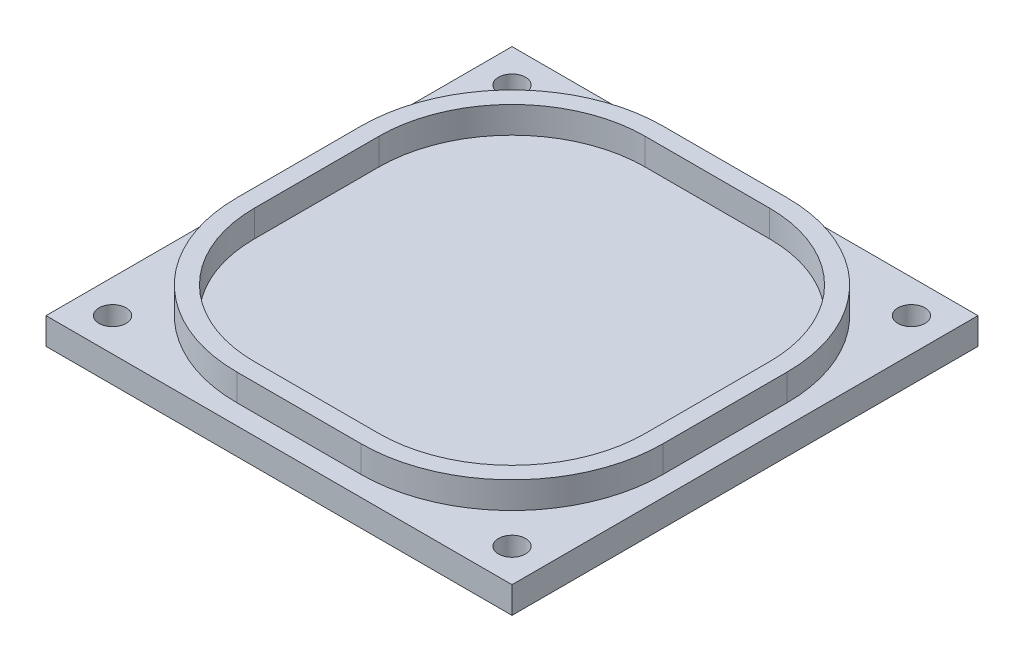
ISO-10303-21;
HEADER;
FILE_DESCRIPTION(('STEP AP214'),'2;1');
FILE_NAME('part.step','',(''),(''),'','','');
FILE_SCHEMA(('AUTOMOTIVE_DESIGN { 1 0 10303 214 1 1 1 1 }'));
ENDSEC;
DATA;
#1=APPLICATION_CONTEXT('core data for automotive mechanical design processes');
#2=APPLICATION_PROTOCOL_DEFINITION('international standard','automotive_design',2000,#1);
#3=PRODUCT_CONTEXT('',#1,'mechanical');
#4=PRODUCT('Part','Part','',(#3));
#5=PRODUCT_RELATED_PRODUCT_CATEGORY('part','',(#4));
#6=PRODUCT_DEFINITION_FORMATION('','',#4);
#7=PRODUCT_DEFINITION_CONTEXT('part definition',#1,'design');
#8=PRODUCT_DEFINITION('design','',#6,#7);
#9=PRODUCT_DEFINITION_SHAPE('','',#8);
#10=(LENGTH_UNIT() NAMED_UNIT(*) SI_UNIT(.MILLI.,.METRE.));
#11=(NAMED_UNIT(*) PLANE_ANGLE_UNIT() SI_UNIT($,.RADIAN.));
#12=(NAMED_UNIT(*) SI_UNIT($,.STERADIAN.) SOLID_ANGLE_UNIT());
#13=UNCERTAINTY_MEASURE_WITH_UNIT(LENGTH_MEASURE(1.E-05),#10,'distance_accuracy_value','');
#14=(GEOMETRIC_REPRESENTATION_CONTEXT(3) GLOBAL_UNCERTAINTY_ASSIGNED_CONTEXT((#13)) GLOBAL_UNIT_ASSIGNED_CONTEXT((#10,
#11,#12)) REPRESENTATION_CONTEXT('',''));
#15=CARTESIAN_POINT('',(0.,0.,0.));
#16=DIRECTION('',(0.,0.,1.));
#17=DIRECTION('',(1.,0.,0.));
#18=AXIS2_PLACEMENT_3D('',#15,#16,#17);
#19=CARTESIAN_POINT('',(0.,0.,0.));
#20=DIRECTION('',(0.,1.,0.));
#21=DIRECTION('',(0.,0.,1.));
#22=AXIS2_PLACEMENT_3D('',#19,#20,#21);
#23=PLANE('',#22);
#24=DIRECTION('',(0.,0.,1.));
#25=VECTOR('',#24,1.);
#26=CARTESIAN_POINT('',(287.147459621555,0.,287.147459621556));
#27=LINE('',#26,#25);
#28=CARTESIAN_POINT('',(287.147459621555,0.,287.147459621556));
#29=VERTEX_POINT('',#28);
#30=CARTESIAN_POINT('',(287.147459621555,0.,339.647459621556));
#31=VERTEX_POINT('',#30);
#32=EDGE_CURVE('E317',#29,#31,#27,.T.);
#33=ORIENTED_EDGE('',*,*,#32,.T.);
#34=DIRECTION('',(1.,0.,0.));
#35=VECTOR('',#34,1.);
#36=CARTESIAN_POINT('',(287.147459621555,0.,339.647459621556));
#37=LINE('',#36,#35);
#38=CARTESIAN_POINT('',(339.647459621555,0.,339.647459621556));
#39=VERTEX_POINT('',#38);
#40=EDGE_CURVE('E335',#31,#39,#37,.T.);
#41=ORIENTED_EDGE('',*,*,#40,.T.);
#42=DIRECTION('',(0.,0.,-1.));
#43=VECTOR('',#42,1.);
#44=CARTESIAN_POINT('',(339.647459621555,0.,339.647459621556));
#45=LINE('',#44,#43);
#46=CARTESIAN_POINT('',(339.647459621555,0.,287.147459621556));
#47=VERTEX_POINT('',#46);
#48=EDGE_CURVE('E338',#39,#47,#45,.T.);
#49=ORIENTED_EDGE('',*,*,#48,.T.);
#50=DIRECTION('',(-1.,0.,0.));
#51=VECTOR('',#50,1.);
#52=CARTESIAN_POINT('',(339.647459621555,0.,287.147459621556));
#53=LINE('',#52,#51);
#54=EDGE_CURVE('E324',#47,#29,#53,.T.);
#55=ORIENTED_EDGE('',*,*,#54,.T.);
#56=EDGE_LOOP('',(#33,#41,#49,#55));
#57=FACE_BOUND('',#56,.T.);
#58=CARTESIAN_POINT('',(335.897459621555,0.,290.897459621556));
#59=DIRECTION('',(0.,1.,0.));
#60=DIRECTION('',(0.,0.,1.));
#61=AXIS2_PLACEMENT_3D('',#58,#59,#60);
#62=CIRCLE('',#61,1.52499999999998);
#63=CARTESIAN_POINT('',(335.897459621555,0.,292.422459621556));
#64=VERTEX_POINT('',#63);
#65=EDGE_CURVE('E311',#64,#64,#62,.T.);
#66=ORIENTED_EDGE('',*,*,#65,.F.);
#67=EDGE_LOOP('',(#66));
#68=FACE_BOUND('',#67,.T.);
#69=CARTESIAN_POINT('',(335.897459621555,0.,335.897459621556));
#70=DIRECTION('',(0.,1.,0.));
#71=DIRECTION('',(0.,0.,1.));
#72=AXIS2_PLACEMENT_3D('',#69,#70,#71);
#73=CIRCLE('',#72,1.52499999999998);
#74=CARTESIAN_POINT('',(335.897459621555,0.,337.422459621556));
#75=VERTEX_POINT('',#74);
#76=EDGE_CURVE('E305',#75,#75,#73,.T.);
#77=ORIENTED_EDGE('',*,*,#76,.F.);
#78=EDGE_LOOP('',(#77));
#79=FACE_BOUND('',#78,.T.);
#80=CARTESIAN_POINT('',(290.897459621555,0.,290.897459621556));
#81=DIRECTION('',(0.,1.,0.));
#82=DIRECTION('',(0.,0.,1.));
#83=AXIS2_PLACEMENT_3D('',#80,#81,#82);
#84=CIRCLE('',#83,1.52499999999998);
#85=CARTESIAN_POINT('',(290.897459621555,0.,292.422459621556));
#86=VERTEX_POINT('',#85);
#87=EDGE_CURVE('E299',#86,#86,#84,.T.);
#88=ORIENTED_EDGE('',*,*,#87,.F.);
#89=EDGE_LOOP('',(#88));
#90=FACE_BOUND('',#89,.T.);
#91=CARTESIAN_POINT('',(290.897459621555,0.,335.897459621556));
#92=DIRECTION('',(0.,1.,0.));
#93=DIRECTION('',(0.,0.,1.));
#94=AXIS2_PLACEMENT_3D('',#91,#92,#93);
#95=CIRCLE('',#94,1.52499999999998);
#96=CARTESIAN_POINT('',(290.897459621555,0.,337.422459621556));
#97=VERTEX_POINT('',#96);
#98=EDGE_CURVE('E295',#97,#97,#95,.T.);
#99=ORIENTED_EDGE('',*,*,#98,.F.);
#100=EDGE_LOOP('',(#99));
#101=FACE_BOUND('',#100,.T.);
#102=DIRECTION('',(-1.,0.,0.));
#103=VECTOR('',#102,1.);
#104=CARTESIAN_POINT('',(320.397459621555,0.,289.397459621556));
#105=LINE('',#104,#103);
#106=CARTESIAN_POINT('',(320.397459621555,0.,289.397459621556));
#107=VERTEX_POINT('',#106);
#108=CARTESIAN_POINT('',(306.397459621555,0.,289.397459621556));
#109=VERTEX_POINT('',#108);
#110=EDGE_CURVE('E262',#107,#109,#105,.T.);
#111=ORIENTED_EDGE('',*,*,#110,.F.);
#112=CARTESIAN_POINT('',(320.397459621555,0.,306.397459621556));
#113=DIRECTION('',(0.,1.,0.));
#114=DIRECTION('',(0.,0.,1.));
#115=AXIS2_PLACEMENT_3D('',#112,#113,#114);
#116=CIRCLE('',#115,17.);
#117=CARTESIAN_POINT('',(337.397459621555,0.,306.397459621556));
#118=VERTEX_POINT('',#117);
#119=EDGE_CURVE('E190',#118,#107,#116,.T.);
#120=ORIENTED_EDGE('',*,*,#119,.F.);
#121=DIRECTION('',(0.,0.,-1.));
#122=VECTOR('',#121,1.);
#123=CARTESIAN_POINT('',(337.397459621555,0.,320.397459621556));
#124=LINE('',#123,#122);
#125=CARTESIAN_POINT('',(337.397459621555,0.,320.397459621556));
#126=VERTEX_POINT('',#125);
#127=EDGE_CURVE('E245',#126,#118,#124,.T.);
#128=ORIENTED_EDGE('',*,*,#127,.F.);
#129=CARTESIAN_POINT('',(320.397459621555,0.,320.397459621556));
#130=DIRECTION('',(0.,1.,0.));
#131=DIRECTION('',(0.,0.,1.));
#132=AXIS2_PLACEMENT_3D('',#129,#130,#131);
#133=CIRCLE('',#132,17.);
#134=CARTESIAN_POINT('',(320.397459621555,0.,337.397459621556));
#135=VERTEX_POINT('',#134);
#136=EDGE_CURVE('E272',#135,#126,#133,.T.);
#137=ORIENTED_EDGE('',*,*,#136,.F.);
#138=DIRECTION('',(1.,0.,0.));
#139=VECTOR('',#138,1.);
#140=CARTESIAN_POINT('',(306.397459621555,0.,337.397459621556));
#141=LINE('',#140,#139);
#142=CARTESIAN_POINT('',(306.397459621555,0.,337.397459621556));
#143=VERTEX_POINT('',#142);
#144=EDGE_CURVE('E270',#143,#135,#141,.T.);
#145=ORIENTED_EDGE('',*,*,#144,.F.);
#146=CARTESIAN_POINT('',(306.397459621555,0.,320.397459621556));
#147=DIRECTION('',(0.,1.,0.));
#148=DIRECTION('',(0.,0.,1.));
#149=AXIS2_PLACEMENT_3D('',#146,#147,#148);
#150=CIRCLE('',#149,17.);
#151=CARTESIAN_POINT('',(289.397459621555,0.,320.397459621556));
#152=VERTEX_POINT('',#151);
#153=EDGE_CURVE('E268',#152,#143,#150,.T.);
#154=ORIENTED_EDGE('',*,*,#153,.F.);
#155=DIRECTION('',(0.,0.,1.));
#156=VECTOR('',#155,1.);
#157=CARTESIAN_POINT('',(289.397459621555,0.,306.397459621556));
#158=LINE('',#157,#156);
#159=CARTESIAN_POINT('',(289.397459621555,0.,306.397459621556));
#160=VERTEX_POINT('',#159);
#161=EDGE_CURVE('E266',#160,#152,#158,.T.);
#162=ORIENTED_EDGE('',*,*,#161,.F.);
#163=CARTESIAN_POINT('',(306.397459621555,0.,306.397459621556));
#164=DIRECTION('',(0.,1.,0.));
#165=DIRECTION('',(0.,0.,-1.));
#166=AXIS2_PLACEMENT_3D('',#163,#164,#165);
#167=CIRCLE('',#166,17.);
#168=EDGE_CURVE('E264',#109,#160,#167,.T.);
#169=ORIENTED_EDGE('',*,*,#168,.F.);
#170=EDGE_LOOP('',(#111,#120,#128,#137,#145,#154,#162,#169));
#171=FACE_BOUND('',#170,.T.);
#172=ADVANCED_FACE('F33',(#57,#68,#79,#90,#101,#171),#23,.T.);
#173=CARTESIAN_POINT('',(287.147459621555,-3.,287.147459621556));
#174=DIRECTION('',(-1.,0.,0.));
#175=DIRECTION('',(0.,0.,1.));
#176=AXIS2_PLACEMENT_3D('',#173,#174,#175);
#177=PLANE('',#176);
#178=ORIENTED_EDGE('',*,*,#32,.F.);
#179=DIRECTION('',(0.,1.,0.));
#180=VECTOR('',#179,1.);
#181=CARTESIAN_POINT('',(287.147459621555,-3.,287.147459621556));
#182=LINE('',#181,#180);
#183=CARTESIAN_POINT('',(287.147459621555,-3.,287.147459621556));
#184=VERTEX_POINT('',#183);
#185=EDGE_CURVE('E11',#184,#29,#182,.T.);
#186=ORIENTED_EDGE('',*,*,#185,.F.);
#187=DIRECTION('',(0.,0.,1.));
#188=VECTOR('',#187,1.);
#189=CARTESIAN_POINT('',(287.147459621555,-3.,287.147459621556));
#190=LINE('',#189,#188);
#191=CARTESIAN_POINT('',(287.147459621555,-3.,339.647459621556));
#192=VERTEX_POINT('',#191);
#193=EDGE_CURVE('E320',#184,#192,#190,.T.);
#194=ORIENTED_EDGE('',*,*,#193,.T.);
#195=DIRECTION('',(0.,1.,0.));
#196=VECTOR('',#195,1.);
#197=CARTESIAN_POINT('',(287.147459621555,-3.,339.647459621556));
#198=LINE('',#197,#196);
#199=EDGE_CURVE('E37',#192,#31,#198,.T.);
#200=ORIENTED_EDGE('',*,*,#199,.T.);
#201=EDGE_LOOP('',(#178,#186,#194,#200));
#202=FACE_BOUND('',#201,.T.);
#203=ADVANCED_FACE('F35',(#202),#177,.T.);
#204=CARTESIAN_POINT('',(339.647459621555,-3.,287.147459621556));
#205=DIRECTION('',(0.,0.,-1.));
#206=DIRECTION('',(-1.,0.,0.));
#207=AXIS2_PLACEMENT_3D('',#204,#205,#206);
#208=PLANE('',#207);
#209=ORIENTED_EDGE('',*,*,#54,.F.);
#210=DIRECTION('',(0.,1.,0.));
#211=VECTOR('',#210,1.);
#212=CARTESIAN_POINT('',(339.647459621555,-3.,287.147459621556));
#213=LINE('',#212,#211);
#214=CARTESIAN_POINT('',(339.647459621555,-3.,287.147459621556));
#215=VERTEX_POINT('',#214);
#216=EDGE_CURVE('E42',#215,#47,#213,.T.);
#217=ORIENTED_EDGE('',*,*,#216,.F.);
#218=DIRECTION('',(-1.,0.,0.));
#219=VECTOR('',#218,1.);
#220=CARTESIAN_POINT('',(339.647459621555,-3.,287.147459621556));
#221=LINE('',#220,#219);
#222=EDGE_CURVE('E330',#215,#184,#221,.T.);
#223=ORIENTED_EDGE('',*,*,#222,.T.);
#224=ORIENTED_EDGE('',*,*,#185,.T.);
#225=EDGE_LOOP('',(#209,#217,#223,#224));
#226=FACE_BOUND('',#225,.T.);
#227=ADVANCED_FACE('F356',(#226),#208,.T.);
#228=CARTESIAN_POINT('',(339.647459621555,-3.,339.647459621556));
#229=DIRECTION('',(1.,0.,0.));
#230=DIRECTION('',(0.,0.,-1.));
#231=AXIS2_PLACEMENT_3D('',#228,#229,#230);
#232=PLANE('',#231);
#233=ORIENTED_EDGE('',*,*,#48,.F.);
#234=DIRECTION('',(0.,1.,0.));
#235=VECTOR('',#234,1.);
#236=CARTESIAN_POINT('',(339.647459621555,-3.,339.647459621556));
#237=LINE('',#236,#235);
#238=CARTESIAN_POINT('',(339.647459621555,-3.,339.647459621556));
#239=VERTEX_POINT('',#238);
#240=EDGE_CURVE('E343',#239,#39,#237,.T.);
#241=ORIENTED_EDGE('',*,*,#240,.F.);
#242=DIRECTION('',(0.,0.,-1.));
#243=VECTOR('',#242,1.);
#244=CARTESIAN_POINT('',(339.647459621555,-3.,339.647459621556));
#245=LINE('',#244,#243);
#246=EDGE_CURVE('E327',#239,#215,#245,.T.);
#247=ORIENTED_EDGE('',*,*,#246,.T.);
#248=ORIENTED_EDGE('',*,*,#216,.T.);
#249=EDGE_LOOP('',(#233,#241,#247,#248));
#250=FACE_BOUND('',#249,.T.);
#251=ADVANCED_FACE('F362',(#250),#232,.T.);
#252=CARTESIAN_POINT('',(287.147459621555,-3.,339.647459621556));
#253=DIRECTION('',(0.,0.,1.));
#254=DIRECTION('',(1.,0.,0.));
#255=AXIS2_PLACEMENT_3D('',#252,#253,#254);
#256=PLANE('',#255);
#257=ORIENTED_EDGE('',*,*,#40,.F.);
#258=ORIENTED_EDGE('',*,*,#199,.F.);
#259=DIRECTION('',(1.,0.,0.));
#260=VECTOR('',#259,1.);
#261=CARTESIAN_POINT('',(287.147459621555,-3.,339.647459621556));
#262=LINE('',#261,#260);
#263=EDGE_CURVE('E323',#192,#239,#262,.T.);
#264=ORIENTED_EDGE('',*,*,#263,.T.);
#265=ORIENTED_EDGE('',*,*,#240,.T.);
#266=EDGE_LOOP('',(#257,#258,#264,#265));
#267=FACE_BOUND('',#266,.T.);
#268=ADVANCED_FACE('F351',(#267),#256,.T.);
#269=CARTESIAN_POINT('',(0.,-3.,0.));
#270=DIRECTION('',(0.,1.,0.));
#271=DIRECTION('',(0.,0.,1.));
#272=AXIS2_PLACEMENT_3D('',#269,#270,#271);
#273=PLANE('',#272);
#274=CARTESIAN_POINT('',(290.897459621555,-3.,335.897459621556));
#275=DIRECTION('',(0.,1.,0.));
#276=DIRECTION('',(0.,0.,1.));
#277=AXIS2_PLACEMENT_3D('',#274,#275,#276);
#278=CIRCLE('',#277,1.52499999999998);
#279=CARTESIAN_POINT('',(290.897459621555,-3.,337.422459621556));
#280=VERTEX_POINT('',#279);
#281=EDGE_CURVE('E296',#280,#280,#278,.T.);
#282=ORIENTED_EDGE('',*,*,#281,.T.);
#283=EDGE_LOOP('',(#282));
#284=FACE_BOUND('',#283,.T.);
#285=CARTESIAN_POINT('',(290.897459621555,-3.,290.897459621556));
#286=DIRECTION('',(0.,1.,0.));
#287=DIRECTION('',(0.,0.,1.));
#288=AXIS2_PLACEMENT_3D('',#285,#286,#287);
#289=CIRCLE('',#288,1.52499999999998);
#290=CARTESIAN_POINT('',(290.897459621555,-3.,292.422459621556));
#291=VERTEX_POINT('',#290);
#292=EDGE_CURVE('E302',#291,#291,#289,.T.);
#293=ORIENTED_EDGE('',*,*,#292,.T.);
#294=EDGE_LOOP('',(#293));
#295=FACE_BOUND('',#294,.T.);
#296=CARTESIAN_POINT('',(335.897459621555,-3.,335.897459621556));
#297=DIRECTION('',(0.,1.,0.));
#298=DIRECTION('',(0.,0.,1.));
#299=AXIS2_PLACEMENT_3D('',#296,#297,#298);
#300=CIRCLE('',#299,1.52499999999998);
#301=CARTESIAN_POINT('',(335.897459621555,-3.,337.422459621556));
#302=VERTEX_POINT('',#301);
#303=EDGE_CURVE('E308',#302,#302,#300,.T.);
#304=ORIENTED_EDGE('',*,*,#303,.T.);
#305=EDGE_LOOP('',(#304));
#306=FACE_BOUND('',#305,.T.);
#307=CARTESIAN_POINT('',(335.897459621555,-3.,290.897459621556));
#308=DIRECTION('',(0.,1.,0.));
#309=DIRECTION('',(0.,0.,1.));
#310=AXIS2_PLACEMENT_3D('',#307,#308,#309);
#311=CIRCLE('',#310,1.52499999999998);
#312=CARTESIAN_POINT('',(335.897459621555,-3.,292.422459621556));
#313=VERTEX_POINT('',#312);
#314=EDGE_CURVE('E314',#313,#313,#311,.T.);
#315=ORIENTED_EDGE('',*,*,#314,.T.);
#316=EDGE_LOOP('',(#315));
#317=FACE_BOUND('',#316,.T.);
#318=ORIENTED_EDGE('',*,*,#193,.F.);
#319=ORIENTED_EDGE('',*,*,#222,.F.);
#320=ORIENTED_EDGE('',*,*,#246,.F.);
#321=ORIENTED_EDGE('',*,*,#263,.F.);
#322=EDGE_LOOP('',(#318,#319,#320,#321));
#323=FACE_BOUND('',#322,.T.);
#324=ADVANCED_FACE('F359',(#284,#295,#306,#317,#323),#273,.F.);
#325=CARTESIAN_POINT('',(335.897459621555,-3.,290.897459621556));
#326=DIRECTION('',(0.,1.,0.));
#327=DIRECTION('',(0.,0.,1.));
#328=AXIS2_PLACEMENT_3D('',#325,#326,#327);
#329=CYLINDRICAL_SURFACE('',#328,1.52499999999998);
#330=ORIENTED_EDGE('',*,*,#314,.F.);
#331=EDGE_LOOP('',(#330));
#332=FACE_BOUND('',#331,.T.);
#333=ORIENTED_EDGE('',*,*,#65,.T.);
#334=EDGE_LOOP('',(#333));
#335=FACE_BOUND('',#334,.T.);
#336=ADVANCED_FACE('F457',(#332,#335),#329,.F.);
#337=CARTESIAN_POINT('',(335.897459621555,-3.,335.897459621556));
#338=DIRECTION('',(0.,1.,0.));
#339=DIRECTION('',(0.,0.,1.));
#340=AXIS2_PLACEMENT_3D('',#337,#338,#339);
#341=CYLINDRICAL_SURFACE('',#340,1.52499999999998);
#342=ORIENTED_EDGE('',*,*,#303,.F.);
#343=EDGE_LOOP('',(#342));
#344=FACE_BOUND('',#343,.T.);
#345=ORIENTED_EDGE('',*,*,#76,.T.);
#346=EDGE_LOOP('',(#345));
#347=FACE_BOUND('',#346,.T.);
#348=ADVANCED_FACE('F453',(#344,#347),#341,.F.);
#349=CARTESIAN_POINT('',(290.897459621555,-3.,290.897459621556));
#350=DIRECTION('',(0.,1.,0.));
#351=DIRECTION('',(0.,0.,1.));
#352=AXIS2_PLACEMENT_3D('',#349,#350,#351);
#353=CYLINDRICAL_SURFACE('',#352,1.52499999999998);
#354=ORIENTED_EDGE('',*,*,#292,.F.);
#355=EDGE_LOOP('',(#354));
#356=FACE_BOUND('',#355,.T.);
#357=ORIENTED_EDGE('',*,*,#87,.T.);
#358=EDGE_LOOP('',(#357));
#359=FACE_BOUND('',#358,.T.);
#360=ADVANCED_FACE('F449',(#356,#359),#353,.F.);
#361=CARTESIAN_POINT('',(290.897459621555,-3.,335.897459621556));
#362=DIRECTION('',(0.,1.,0.));
#363=DIRECTION('',(0.,0.,1.));
#364=AXIS2_PLACEMENT_3D('',#361,#362,#363);
#365=CYLINDRICAL_SURFACE('',#364,1.52499999999998);
#366=ORIENTED_EDGE('',*,*,#281,.F.);
#367=EDGE_LOOP('',(#366));
#368=FACE_BOUND('',#367,.T.);
#369=ORIENTED_EDGE('',*,*,#98,.T.);
#370=EDGE_LOOP('',(#369));
#371=FACE_BOUND('',#370,.T.);
#372=ADVANCED_FACE('F416',(#368,#371),#365,.F.);
#373=CARTESIAN_POINT('',(320.397459621555,3.,306.397459621556));
#374=DIRECTION('',(0.,1.,0.));
#375=DIRECTION('',(0.,0.,1.));
#376=AXIS2_PLACEMENT_3D('',#373,#374,#375);
#377=PLANE('',#376);
#378=CARTESIAN_POINT('',(320.397459621555,3.,306.397459621556));
#379=DIRECTION('',(0.,1.,0.));
#380=DIRECTION('',(0.,0.,1.));
#381=AXIS2_PLACEMENT_3D('',#378,#379,#380);
#382=CIRCLE('',#381,17.);
#383=CARTESIAN_POINT('',(337.397459621555,3.,306.397459621556));
#384=VERTEX_POINT('',#383);
#385=CARTESIAN_POINT('',(320.397459621555,3.,289.397459621556));
#386=VERTEX_POINT('',#385);
#387=EDGE_CURVE('E241',#384,#386,#382,.T.);
#388=ORIENTED_EDGE('',*,*,#387,.T.);
#389=DIRECTION('',(-1.,0.,0.));
#390=VECTOR('',#389,1.);
#391=CARTESIAN_POINT('',(320.397459621555,3.,289.397459621556));
#392=LINE('',#391,#390);
#393=CARTESIAN_POINT('',(306.397459621555,3.,289.397459621556));
#394=VERTEX_POINT('',#393);
#395=EDGE_CURVE('E244',#386,#394,#392,.T.);
#396=ORIENTED_EDGE('',*,*,#395,.T.);
#397=CARTESIAN_POINT('',(306.397459621555,3.,306.397459621556));
#398=DIRECTION('',(0.,1.,0.));
#399=DIRECTION('',(0.,0.,-1.));
#400=AXIS2_PLACEMENT_3D('',#397,#398,#399);
#401=CIRCLE('',#400,17.);
#402=CARTESIAN_POINT('',(289.397459621555,3.,306.397459621556));
#403=VERTEX_POINT('',#402);
#404=EDGE_CURVE('E247',#394,#403,#401,.T.);
#405=ORIENTED_EDGE('',*,*,#404,.T.);
#406=DIRECTION('',(0.,0.,1.));
#407=VECTOR('',#406,1.);
#408=CARTESIAN_POINT('',(289.397459621555,3.,306.397459621556));
#409=LINE('',#408,#407);
#410=CARTESIAN_POINT('',(289.397459621555,3.,320.397459621556));
#411=VERTEX_POINT('',#410);
#412=EDGE_CURVE('E249',#403,#411,#409,.T.);
#413=ORIENTED_EDGE('',*,*,#412,.T.);
#414=CARTESIAN_POINT('',(306.397459621555,3.,320.397459621556));
#415=DIRECTION('',(0.,1.,0.));
#416=DIRECTION('',(0.,0.,1.));
#417=AXIS2_PLACEMENT_3D('',#414,#415,#416);
#418=CIRCLE('',#417,17.);
#419=CARTESIAN_POINT('',(306.397459621555,3.,337.397459621556));
#420=VERTEX_POINT('',#419);
#421=EDGE_CURVE('E251',#411,#420,#418,.T.);
#422=ORIENTED_EDGE('',*,*,#421,.T.);
#423=DIRECTION('',(1.,0.,0.));
#424=VECTOR('',#423,1.);
#425=CARTESIAN_POINT('',(306.397459621555,3.,337.397459621556));
#426=LINE('',#425,#424);
#427=CARTESIAN_POINT('',(320.397459621555,3.,337.397459621556));
#428=VERTEX_POINT('',#427);
#429=EDGE_CURVE('E253',#420,#428,#426,.T.);
#430=ORIENTED_EDGE('',*,*,#429,.T.);
#431=CARTESIAN_POINT('',(320.397459621555,3.,320.397459621556));
#432=DIRECTION('',(0.,1.,0.));
#433=DIRECTION('',(0.,0.,1.));
#434=AXIS2_PLACEMENT_3D('',#431,#432,#433);
#435=CIRCLE('',#434,17.);
#436=CARTESIAN_POINT('',(337.397459621555,3.,320.397459621556));
#437=VERTEX_POINT('',#436);
#438=EDGE_CURVE('E255',#428,#437,#435,.T.);
#439=ORIENTED_EDGE('',*,*,#438,.T.);
#440=DIRECTION('',(0.,0.,-1.));
#441=VECTOR('',#440,1.);
#442=CARTESIAN_POINT('',(337.397459621555,3.,320.397459621556));
#443=LINE('',#442,#441);
#444=EDGE_CURVE('E257',#437,#384,#443,.T.);
#445=ORIENTED_EDGE('',*,*,#444,.T.);
#446=EDGE_LOOP('',(#388,#396,#405,#413,#422,#430,#439,#445));
#447=FACE_BOUND('',#446,.T.);
#448=DIRECTION('',(1.,0.,0.));
#449=VECTOR('',#448,1.);
#450=CARTESIAN_POINT('',(306.397459621555,3.,335.397459621556));
#451=LINE('',#450,#449);
#452=CARTESIAN_POINT('',(306.397459621555,3.,335.397459621556));
#453=VERTEX_POINT('',#452);
#454=CARTESIAN_POINT('',(320.397459621555,3.,335.397459621556));
#455=VERTEX_POINT('',#454);
#456=EDGE_CURVE('E182',#453,#455,#451,.T.);
#457=ORIENTED_EDGE('',*,*,#456,.F.);
#458=CARTESIAN_POINT('',(306.397459621555,3.,320.397459621556));
#459=DIRECTION('',(0.,1.,0.));
#460=DIRECTION('',(0.,0.,1.));
#461=AXIS2_PLACEMENT_3D('',#458,#459,#460);
#462=CIRCLE('',#461,15.);
#463=CARTESIAN_POINT('',(291.397459621555,3.,320.397459621556));
#464=VERTEX_POINT('',#463);
#465=EDGE_CURVE('E173',#464,#453,#462,.T.);
#466=ORIENTED_EDGE('',*,*,#465,.F.);
#467=DIRECTION('',(0.,0.,1.));
#468=VECTOR('',#467,1.);
#469=CARTESIAN_POINT('',(291.397459621555,3.,306.397459621556));
#470=LINE('',#469,#468);
#471=CARTESIAN_POINT('',(291.397459621555,3.,306.397459621556));
#472=VERTEX_POINT('',#471);
#473=EDGE_CURVE('E209',#472,#464,#470,.T.);
#474=ORIENTED_EDGE('',*,*,#473,.F.);
#475=CARTESIAN_POINT('',(306.397459621555,3.,306.397459621556));
#476=DIRECTION('',(0.,1.,0.));
#477=DIRECTION('',(0.,0.,-1.));
#478=AXIS2_PLACEMENT_3D('',#475,#476,#477);
#479=CIRCLE('',#478,15.);
#480=CARTESIAN_POINT('',(306.397459621555,3.,291.397459621556));
#481=VERTEX_POINT('',#480);
#482=EDGE_CURVE('E206',#481,#472,#479,.T.);
#483=ORIENTED_EDGE('',*,*,#482,.F.);
#484=DIRECTION('',(-1.,0.,0.));
#485=VECTOR('',#484,1.);
#486=CARTESIAN_POINT('',(320.397459621555,3.,291.397459621556));
#487=LINE('',#486,#485);
#488=CARTESIAN_POINT('',(320.397459621555,3.,291.397459621556));
#489=VERTEX_POINT('',#488);
#490=EDGE_CURVE('E204',#489,#481,#487,.T.);
#491=ORIENTED_EDGE('',*,*,#490,.F.);
#492=CARTESIAN_POINT('',(320.397459621555,3.,306.397459621556));
#493=DIRECTION('',(0.,1.,0.));
#494=DIRECTION('',(0.,0.,1.));
#495=AXIS2_PLACEMENT_3D('',#492,#493,#494);
#496=CIRCLE('',#495,15.);
#497=CARTESIAN_POINT('',(335.397459621555,3.,306.397459621556));
#498=VERTEX_POINT('',#497);
#499=EDGE_CURVE('E202',#498,#489,#496,.T.);
#500=ORIENTED_EDGE('',*,*,#499,.F.);
#501=DIRECTION('',(0.,0.,-1.));
#502=VECTOR('',#501,1.);
#503=CARTESIAN_POINT('',(335.397459621555,3.,320.397459621556));
#504=LINE('',#503,#502);
#505=CARTESIAN_POINT('',(335.397459621555,3.,320.397459621556));
#506=VERTEX_POINT('',#505);
#507=EDGE_CURVE('E198',#506,#498,#504,.T.);
#508=ORIENTED_EDGE('',*,*,#507,.F.);
#509=CARTESIAN_POINT('',(320.397459621555,3.,320.397459621556));
#510=DIRECTION('',(0.,1.,0.));
#511=DIRECTION('',(0.,0.,1.));
#512=AXIS2_PLACEMENT_3D('',#509,#510,#511);
#513=CIRCLE('',#512,15.);
#514=EDGE_CURVE('E196',#455,#506,#513,.T.);
#515=ORIENTED_EDGE('',*,*,#514,.F.);
#516=EDGE_LOOP('',(#457,#466,#474,#483,#491,#500,#508,#515));
#517=FACE_BOUND('',#516,.T.);
#518=ADVANCED_FACE('F194',(#447,#517),#377,.T.);
#519=CARTESIAN_POINT('',(320.397459621555,3.,306.397459621556));
#520=DIRECTION('',(0.,-1.,0.));
#521=DIRECTION('',(0.,0.,-1.));
#522=AXIS2_PLACEMENT_3D('',#519,#520,#521);
#523=CYLINDRICAL_SURFACE('',#522,17.);
#524=ORIENTED_EDGE('',*,*,#119,.T.);
#525=DIRECTION('',(0.,-1.,0.));
#526=VECTOR('',#525,1.);
#527=CARTESIAN_POINT('',(320.397459621555,3.,289.397459621556));
#528=LINE('',#527,#526);
#529=EDGE_CURVE('E293',#386,#107,#528,.T.);
#530=ORIENTED_EDGE('',*,*,#529,.F.);
#531=ORIENTED_EDGE('',*,*,#387,.F.);
#532=DIRECTION('',(0.,-1.,0.));
#533=VECTOR('',#532,1.);
#534=CARTESIAN_POINT('',(337.397459621555,3.,306.397459621556));
#535=LINE('',#534,#533);
#536=EDGE_CURVE('E259',#384,#118,#535,.T.);
#537=ORIENTED_EDGE('',*,*,#536,.T.);
#538=EDGE_LOOP('',(#524,#530,#531,#537));
#539=FACE_BOUND('',#538,.T.);
#540=ADVANCED_FACE('F415',(#539),#523,.T.);
#541=CARTESIAN_POINT('',(320.397459621555,3.,289.397459621556));
#542=DIRECTION('',(0.,0.,1.));
#543=DIRECTION('',(1.,0.,0.));
#544=AXIS2_PLACEMENT_3D('',#541,#542,#543);
#545=PLANE('',#544);
#546=ORIENTED_EDGE('',*,*,#110,.T.);
#547=DIRECTION('',(0.,-1.,0.));
#548=VECTOR('',#547,1.);
#549=CARTESIAN_POINT('',(306.397459621555,3.,289.397459621556));
#550=LINE('',#549,#548);
#551=EDGE_CURVE('E290',#394,#109,#550,.T.);
#552=ORIENTED_EDGE('',*,*,#551,.F.);
#553=ORIENTED_EDGE('',*,*,#395,.F.);
#554=ORIENTED_EDGE('',*,*,#529,.T.);
#555=EDGE_LOOP('',(#546,#552,#553,#554));
#556=FACE_BOUND('',#555,.T.);
#557=ADVANCED_FACE('F439',(#556),#545,.F.);
#558=CARTESIAN_POINT('',(306.397459621555,3.,306.397459621556));
#559=DIRECTION('',(0.,-1.,0.));
#560=DIRECTION('',(0.,0.,-1.));
#561=AXIS2_PLACEMENT_3D('',#558,#559,#560);
#562=CYLINDRICAL_SURFACE('',#561,17.);
#563=ORIENTED_EDGE('',*,*,#168,.T.);
#564=DIRECTION('',(0.,-1.,0.));
#565=VECTOR('',#564,1.);
#566=CARTESIAN_POINT('',(289.397459621555,3.,306.397459621556));
#567=LINE('',#566,#565);
#568=EDGE_CURVE('E287',#403,#160,#567,.T.);
#569=ORIENTED_EDGE('',*,*,#568,.F.);
#570=ORIENTED_EDGE('',*,*,#404,.F.);
#571=ORIENTED_EDGE('',*,*,#551,.T.);
#572=EDGE_LOOP('',(#563,#569,#570,#571));
#573=FACE_BOUND('',#572,.T.);
#574=ADVANCED_FACE('F435',(#573),#562,.T.);
#575=CARTESIAN_POINT('',(289.397459621555,3.,306.397459621556));
#576=DIRECTION('',(1.,0.,0.));
#577=DIRECTION('',(0.,0.,-1.));
#578=AXIS2_PLACEMENT_3D('',#575,#576,#577);
#579=PLANE('',#578);
#580=ORIENTED_EDGE('',*,*,#161,.T.);
#581=DIRECTION('',(0.,-1.,0.));
#582=VECTOR('',#581,1.);
#583=CARTESIAN_POINT('',(289.397459621555,3.,320.397459621556));
#584=LINE('',#583,#582);
#585=EDGE_CURVE('E284',#411,#152,#584,.T.);
#586=ORIENTED_EDGE('',*,*,#585,.F.);
#587=ORIENTED_EDGE('',*,*,#412,.F.);
#588=ORIENTED_EDGE('',*,*,#568,.T.);
#589=EDGE_LOOP('',(#580,#586,#587,#588));
#590=FACE_BOUND('',#589,.T.);
#591=ADVANCED_FACE('F431',(#590),#579,.F.);
#592=CARTESIAN_POINT('',(306.397459621555,3.,320.397459621556));
#593=DIRECTION('',(0.,-1.,0.));
#594=DIRECTION('',(0.,0.,-1.));
#595=AXIS2_PLACEMENT_3D('',#592,#593,#594);
#596=CYLINDRICAL_SURFACE('',#595,17.);
#597=ORIENTED_EDGE('',*,*,#153,.T.);
#598=DIRECTION('',(0.,-1.,0.));
#599=VECTOR('',#598,1.);
#600=CARTESIAN_POINT('',(306.397459621555,3.,337.397459621556));
#601=LINE('',#600,#599);
#602=EDGE_CURVE('E281',#420,#143,#601,.T.);
#603=ORIENTED_EDGE('',*,*,#602,.F.);
#604=ORIENTED_EDGE('',*,*,#421,.F.);
#605=ORIENTED_EDGE('',*,*,#585,.T.);
#606=EDGE_LOOP('',(#597,#603,#604,#605));
#607=FACE_BOUND('',#606,.T.);
#608=ADVANCED_FACE('F427',(#607),#596,.T.);
#609=CARTESIAN_POINT('',(306.397459621555,3.,337.397459621556));
#610=DIRECTION('',(0.,0.,-1.));
#611=DIRECTION('',(-1.,0.,0.));
#612=AXIS2_PLACEMENT_3D('',#609,#610,#611);
#613=PLANE('',#612);
#614=ORIENTED_EDGE('',*,*,#144,.T.);
#615=DIRECTION('',(0.,-1.,0.));
#616=VECTOR('',#615,1.);
#617=CARTESIAN_POINT('',(320.397459621555,3.,337.397459621556));
#618=LINE('',#617,#616);
#619=EDGE_CURVE('E278',#428,#135,#618,.T.);
#620=ORIENTED_EDGE('',*,*,#619,.F.);
#621=ORIENTED_EDGE('',*,*,#429,.F.);
#622=ORIENTED_EDGE('',*,*,#602,.T.);
#623=EDGE_LOOP('',(#614,#620,#621,#622));
#624=FACE_BOUND('',#623,.T.);
#625=ADVANCED_FACE('F423',(#624),#613,.F.);
#626=CARTESIAN_POINT('',(320.397459621555,3.,320.397459621556));
#627=DIRECTION('',(0.,-1.,0.));
#628=DIRECTION('',(0.,0.,-1.));
#629=AXIS2_PLACEMENT_3D('',#626,#627,#628);
#630=CYLINDRICAL_SURFACE('',#629,17.);
#631=ORIENTED_EDGE('',*,*,#136,.T.);
#632=DIRECTION('',(0.,-1.,0.));
#633=VECTOR('',#632,1.);
#634=CARTESIAN_POINT('',(337.397459621555,3.,320.397459621556));
#635=LINE('',#634,#633);
#636=EDGE_CURVE('E50',#437,#126,#635,.T.);
#637=ORIENTED_EDGE('',*,*,#636,.F.);
#638=ORIENTED_EDGE('',*,*,#438,.F.);
#639=ORIENTED_EDGE('',*,*,#619,.T.);
#640=EDGE_LOOP('',(#631,#637,#638,#639));
#641=FACE_BOUND('',#640,.T.);
#642=ADVANCED_FACE('F420',(#641),#630,.T.);
#643=CARTESIAN_POINT('',(337.397459621555,3.,320.397459621556));
#644=DIRECTION('',(-1.,0.,0.));
#645=DIRECTION('',(0.,0.,1.));
#646=AXIS2_PLACEMENT_3D('',#643,#644,#645);
#647=PLANE('',#646);
#648=ORIENTED_EDGE('',*,*,#127,.T.);
#649=ORIENTED_EDGE('',*,*,#536,.F.);
#650=ORIENTED_EDGE('',*,*,#444,.F.);
#651=ORIENTED_EDGE('',*,*,#636,.T.);
#652=EDGE_LOOP('',(#648,#649,#650,#651));
#653=FACE_BOUND('',#652,.T.);
#654=ADVANCED_FACE('F412',(#653),#647,.F.);
#655=CARTESIAN_POINT('',(306.397459621555,3.,320.397459621556));
#656=DIRECTION('',(0.,-1.,0.));
#657=DIRECTION('',(0.,0.,-1.));
#658=AXIS2_PLACEMENT_3D('',#655,#656,#657);
#659=CYLINDRICAL_SURFACE('',#658,15.);
#660=CARTESIAN_POINT('',(306.397459621555,0.,320.397459621556));
#661=DIRECTION('',(0.,1.,0.));
#662=DIRECTION('',(0.,0.,1.));
#663=AXIS2_PLACEMENT_3D('',#660,#661,#662);
#664=CIRCLE('',#663,15.);
#665=CARTESIAN_POINT('',(291.397459621555,0.,320.397459621556));
#666=VERTEX_POINT('',#665);
#667=CARTESIAN_POINT('',(306.397459621555,0.,335.397459621556));
#668=VERTEX_POINT('',#667);
#669=EDGE_CURVE('E58',#666,#668,#664,.T.);
#670=ORIENTED_EDGE('',*,*,#669,.F.);
#671=DIRECTION('',(0.,-1.,0.));
#672=VECTOR('',#671,1.);
#673=CARTESIAN_POINT('',(291.397459621555,3.,320.397459621556));
#674=LINE('',#673,#672);
#675=EDGE_CURVE('E178',#464,#666,#674,.T.);
#676=ORIENTED_EDGE('',*,*,#675,.F.);
#677=ORIENTED_EDGE('',*,*,#465,.T.);
#678=DIRECTION('',(0.,-1.,0.));
#679=VECTOR('',#678,1.);
#680=CARTESIAN_POINT('',(306.397459621555,3.,335.397459621556));
#681=LINE('',#680,#679);
#682=EDGE_CURVE('E176',#453,#668,#681,.T.);
#683=ORIENTED_EDGE('',*,*,#682,.T.);
#684=EDGE_LOOP('',(#670,#676,#677,#683));
#685=FACE_BOUND('',#684,.T.);
#686=ADVANCED_FACE('F175',(#685),#659,.F.);
#687=CARTESIAN_POINT('',(306.397459621555,3.,335.397459621556));
#688=DIRECTION('',(0.,0.,-1.));
#689=DIRECTION('',(-1.,0.,0.));
#690=AXIS2_PLACEMENT_3D('',#687,#688,#689);
#691=PLANE('',#690);
#692=DIRECTION('',(1.,0.,0.));
#693=VECTOR('',#692,1.);
#694=CARTESIAN_POINT('',(306.397459621555,0.,335.397459621556));
#695=LINE('',#694,#693);
#696=CARTESIAN_POINT('',(320.397459621555,0.,335.397459621556));
#697=VERTEX_POINT('',#696);
#698=EDGE_CURVE('E189',#668,#697,#695,.T.);
#699=ORIENTED_EDGE('',*,*,#698,.F.);
#700=ORIENTED_EDGE('',*,*,#682,.F.);
#701=ORIENTED_EDGE('',*,*,#456,.T.);
#702=DIRECTION('',(0.,-1.,0.));
#703=VECTOR('',#702,1.);
#704=CARTESIAN_POINT('',(320.397459621555,3.,335.397459621556));
#705=LINE('',#704,#703);
#706=EDGE_CURVE('E191',#455,#697,#705,.T.);
#707=ORIENTED_EDGE('',*,*,#706,.T.);
#708=EDGE_LOOP('',(#699,#700,#701,#707));
#709=FACE_BOUND('',#708,.T.);
#710=ADVANCED_FACE('F186',(#709),#691,.T.);
#711=CARTESIAN_POINT('',(320.397459621555,3.,320.397459621556));
#712=DIRECTION('',(0.,-1.,0.));
#713=DIRECTION('',(0.,0.,-1.));
#714=AXIS2_PLACEMENT_3D('',#711,#712,#713);
#715=CYLINDRICAL_SURFACE('',#714,15.);
#716=CARTESIAN_POINT('',(320.397459621555,0.,320.397459621556));
#717=DIRECTION('',(0.,1.,0.));
#718=DIRECTION('',(0.,0.,1.));
#719=AXIS2_PLACEMENT_3D('',#716,#717,#718);
#720=CIRCLE('',#719,15.);
#721=CARTESIAN_POINT('',(335.397459621555,0.,320.397459621556));
#722=VERTEX_POINT('',#721);
#723=EDGE_CURVE('E213',#697,#722,#720,.T.);
#724=ORIENTED_EDGE('',*,*,#723,.F.);
#725=ORIENTED_EDGE('',*,*,#706,.F.);
#726=ORIENTED_EDGE('',*,*,#514,.T.);
#727=DIRECTION('',(0.,-1.,0.));
#728=VECTOR('',#727,1.);
#729=CARTESIAN_POINT('',(335.397459621555,3.,320.397459621556));
#730=LINE('',#729,#728);
#731=EDGE_CURVE('E237',#506,#722,#730,.T.);
#732=ORIENTED_EDGE('',*,*,#731,.T.);
#733=EDGE_LOOP('',(#724,#725,#726,#732));
#734=FACE_BOUND('',#733,.T.);
#735=ADVANCED_FACE('F403',(#734),#715,.F.);
#736=CARTESIAN_POINT('',(335.397459621555,3.,320.397459621556));
#737=DIRECTION('',(-1.,0.,0.));
#738=DIRECTION('',(0.,0.,1.));
#739=AXIS2_PLACEMENT_3D('',#736,#737,#738);
#740=PLANE('',#739);
#741=DIRECTION('',(0.,0.,-1.));
#742=VECTOR('',#741,1.);
#743=CARTESIAN_POINT('',(335.397459621555,0.,320.397459621556));
#744=LINE('',#743,#742);
#745=CARTESIAN_POINT('',(335.397459621555,0.,306.397459621556));
#746=VERTEX_POINT('',#745);
#747=EDGE_CURVE('E215',#722,#746,#744,.T.);
#748=ORIENTED_EDGE('',*,*,#747,.F.);
#749=ORIENTED_EDGE('',*,*,#731,.F.);
#750=ORIENTED_EDGE('',*,*,#507,.T.);
#751=DIRECTION('',(0.,-1.,0.));
#752=VECTOR('',#751,1.);
#753=CARTESIAN_POINT('',(335.397459621555,3.,306.397459621556));
#754=LINE('',#753,#752);
#755=EDGE_CURVE('E234',#498,#746,#754,.T.);
#756=ORIENTED_EDGE('',*,*,#755,.T.);
#757=EDGE_LOOP('',(#748,#749,#750,#756));
#758=FACE_BOUND('',#757,.T.);
#759=ADVANCED_FACE('F399',(#758),#740,.T.);
#760=CARTESIAN_POINT('',(320.397459621555,3.,306.397459621556));
#761=DIRECTION('',(0.,-1.,0.));
#762=DIRECTION('',(0.,0.,-1.));
#763=AXIS2_PLACEMENT_3D('',#760,#761,#762);
#764=CYLINDRICAL_SURFACE('',#763,15.);
#765=CARTESIAN_POINT('',(320.397459621555,0.,306.397459621556));
#766=DIRECTION('',(0.,1.,0.));
#767=DIRECTION('',(0.,0.,1.));
#768=AXIS2_PLACEMENT_3D('',#765,#766,#767);
#769=CIRCLE('',#768,15.);
#770=CARTESIAN_POINT('',(320.397459621555,0.,291.397459621556));
#771=VERTEX_POINT('',#770);
#772=EDGE_CURVE('E217',#746,#771,#769,.T.);
#773=ORIENTED_EDGE('',*,*,#772,.F.);
#774=ORIENTED_EDGE('',*,*,#755,.F.);
#775=ORIENTED_EDGE('',*,*,#499,.T.);
#776=DIRECTION('',(0.,-1.,0.));
#777=VECTOR('',#776,1.);
#778=CARTESIAN_POINT('',(320.397459621555,3.,291.397459621556));
#779=LINE('',#778,#777);
#780=EDGE_CURVE('E231',#489,#771,#779,.T.);
#781=ORIENTED_EDGE('',*,*,#780,.T.);
#782=EDGE_LOOP('',(#773,#774,#775,#781));
#783=FACE_BOUND('',#782,.T.);
#784=ADVANCED_FACE('F395',(#783),#764,.F.);
#785=CARTESIAN_POINT('',(320.397459621555,3.,291.397459621556));
#786=DIRECTION('',(0.,0.,1.));
#787=DIRECTION('',(1.,0.,0.));
#788=AXIS2_PLACEMENT_3D('',#785,#786,#787);
#789=PLANE('',#788);
#790=DIRECTION('',(-1.,0.,0.));
#791=VECTOR('',#790,1.);
#792=CARTESIAN_POINT('',(320.397459621555,0.,291.397459621556));
#793=LINE('',#792,#791);
#794=CARTESIAN_POINT('',(306.397459621555,0.,291.397459621556));
#795=VERTEX_POINT('',#794);
#796=EDGE_CURVE('E219',#771,#795,#793,.T.);
#797=ORIENTED_EDGE('',*,*,#796,.F.);
#798=ORIENTED_EDGE('',*,*,#780,.F.);
#799=ORIENTED_EDGE('',*,*,#490,.T.);
#800=DIRECTION('',(0.,-1.,0.));
#801=VECTOR('',#800,1.);
#802=CARTESIAN_POINT('',(306.397459621555,3.,291.397459621556));
#803=LINE('',#802,#801);
#804=EDGE_CURVE('E228',#481,#795,#803,.T.);
#805=ORIENTED_EDGE('',*,*,#804,.T.);
#806=EDGE_LOOP('',(#797,#798,#799,#805));
#807=FACE_BOUND('',#806,.T.);
#808=ADVANCED_FACE('F388',(#807),#789,.T.);
#809=CARTESIAN_POINT('',(306.397459621555,3.,306.397459621556));
#810=DIRECTION('',(0.,-1.,0.));
#811=DIRECTION('',(0.,0.,-1.));
#812=AXIS2_PLACEMENT_3D('',#809,#810,#811);
#813=CYLINDRICAL_SURFACE('',#812,15.);
#814=CARTESIAN_POINT('',(306.397459621555,0.,306.397459621556));
#815=DIRECTION('',(0.,1.,0.));
#816=DIRECTION('',(0.,0.,-1.));
#817=AXIS2_PLACEMENT_3D('',#814,#815,#816);
#818=CIRCLE('',#817,15.);
#819=CARTESIAN_POINT('',(291.397459621555,0.,306.397459621556));
#820=VERTEX_POINT('',#819);
#821=EDGE_CURVE('E221',#795,#820,#818,.T.);
#822=ORIENTED_EDGE('',*,*,#821,.F.);
#823=ORIENTED_EDGE('',*,*,#804,.F.);
#824=ORIENTED_EDGE('',*,*,#482,.T.);
#825=DIRECTION('',(0.,-1.,0.));
#826=VECTOR('',#825,1.);
#827=CARTESIAN_POINT('',(291.397459621555,3.,306.397459621556));
#828=LINE('',#827,#826);
#829=EDGE_CURVE('E225',#472,#820,#828,.T.);
#830=ORIENTED_EDGE('',*,*,#829,.T.);
#831=EDGE_LOOP('',(#822,#823,#824,#830));
#832=FACE_BOUND('',#831,.T.);
#833=ADVANCED_FACE('F382',(#832),#813,.F.);
#834=CARTESIAN_POINT('',(291.397459621555,3.,306.397459621556));
#835=DIRECTION('',(1.,0.,0.));
#836=DIRECTION('',(0.,0.,-1.));
#837=AXIS2_PLACEMENT_3D('',#834,#835,#836);
#838=PLANE('',#837);
#839=DIRECTION('',(0.,0.,1.));
#840=VECTOR('',#839,1.);
#841=CARTESIAN_POINT('',(291.397459621555,0.,306.397459621556));
#842=LINE('',#841,#840);
#843=EDGE_CURVE('E183',#820,#666,#842,.T.);
#844=ORIENTED_EDGE('',*,*,#843,.F.);
#845=ORIENTED_EDGE('',*,*,#829,.F.);
#846=ORIENTED_EDGE('',*,*,#473,.T.);
#847=ORIENTED_EDGE('',*,*,#675,.T.);
#848=EDGE_LOOP('',(#844,#845,#846,#847));
#849=FACE_BOUND('',#848,.T.);
#850=ADVANCED_FACE('F378',(#849),#838,.T.);
#851=ORIENTED_EDGE('',*,*,#669,.T.);
#852=ORIENTED_EDGE('',*,*,#698,.T.);
#853=ORIENTED_EDGE('',*,*,#723,.T.);
#854=ORIENTED_EDGE('',*,*,#747,.T.);
#855=ORIENTED_EDGE('',*,*,#772,.T.);
#856=ORIENTED_EDGE('',*,*,#796,.T.);
#857=ORIENTED_EDGE('',*,*,#821,.T.);
#858=ORIENTED_EDGE('',*,*,#843,.T.);
#859=EDGE_LOOP('',(#851,#852,#853,#854,#855,#856,#857,#858));
#860=FACE_BOUND('',#859,.T.);
#861=ADVANCED_FACE('F372',(#860),#23,.T.);
#862=CLOSED_SHELL('',(#172,#203,#227,#251,#268,#324,#336,#348,#360,#372,#518,#540,#557,#574,
#591,#608,#625,#642,#654,#686,#710,#735,#759,#784,#808,#833,#850,#861));
#863=MANIFOLD_SOLID_BREP('B2',#862);
#864=ADVANCED_BREP_SHAPE_REPRESENTATION('',(#18,#863),#14);
#865=SHAPE_DEFINITION_REPRESENTATION(#9,#864);
ENDSEC;
END-ISO-10303-21;
